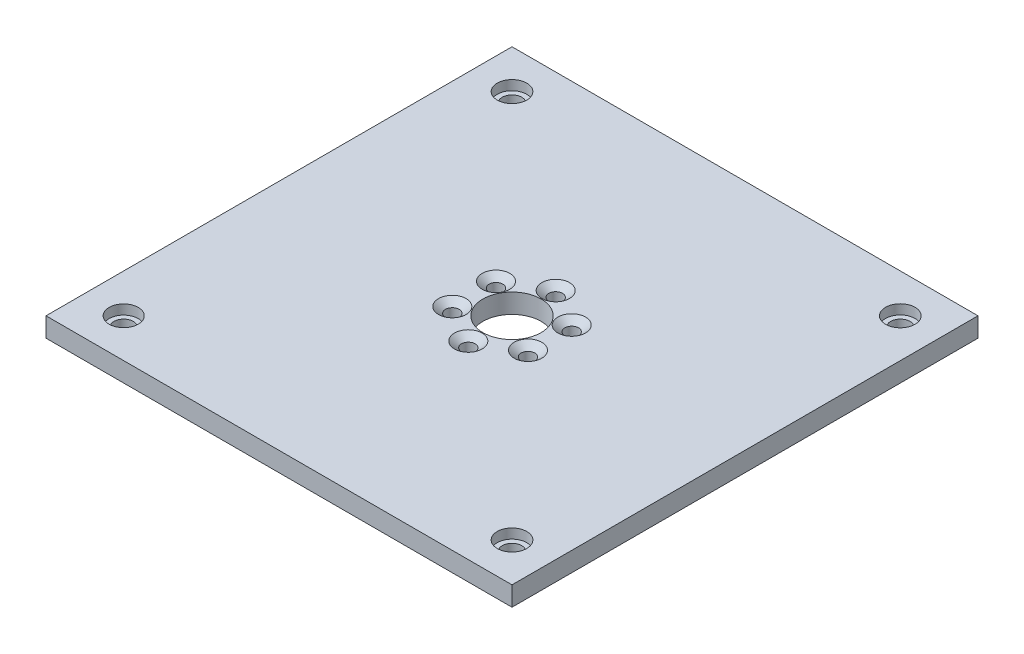
ISO-10303-21;
HEADER;
FILE_DESCRIPTION(('STEP AP214'),'2;1');
FILE_NAME('part.step','',(''),(''),'','','');
FILE_SCHEMA(('AUTOMOTIVE_DESIGN { 1 0 10303 214 1 1 1 1 }'));
ENDSEC;
DATA;
#1=APPLICATION_CONTEXT('core data for automotive mechanical design processes');
#2=APPLICATION_PROTOCOL_DEFINITION('international standard','automotive_design',2000,#1);
#3=PRODUCT_CONTEXT('',#1,'mechanical');
#4=PRODUCT('Part','Part','',(#3));
#5=PRODUCT_RELATED_PRODUCT_CATEGORY('part','',(#4));
#6=PRODUCT_DEFINITION_FORMATION('','',#4);
#7=PRODUCT_DEFINITION_CONTEXT('part definition',#1,'design');
#8=PRODUCT_DEFINITION('design','',#6,#7);
#9=PRODUCT_DEFINITION_SHAPE('','',#8);
#10=(LENGTH_UNIT() NAMED_UNIT(*) SI_UNIT(.MILLI.,.METRE.));
#11=(NAMED_UNIT(*) PLANE_ANGLE_UNIT() SI_UNIT($,.RADIAN.));
#12=(NAMED_UNIT(*) SI_UNIT($,.STERADIAN.) SOLID_ANGLE_UNIT());
#13=UNCERTAINTY_MEASURE_WITH_UNIT(LENGTH_MEASURE(1.E-05),#10,'distance_accuracy_value','');
#14=(GEOMETRIC_REPRESENTATION_CONTEXT(3) GLOBAL_UNCERTAINTY_ASSIGNED_CONTEXT((#13)) GLOBAL_UNIT_ASSIGNED_CONTEXT((#10,
#11,#12)) REPRESENTATION_CONTEXT('',''));
#15=CARTESIAN_POINT('',(0.,0.,0.));
#16=DIRECTION('',(0.,0.,1.));
#17=DIRECTION('',(1.,0.,0.));
#18=AXIS2_PLACEMENT_3D('',#15,#16,#17);
#19=CARTESIAN_POINT('',(139.7,6.35,-12.7));
#20=DIRECTION('',(0.,1.,0.));
#21=DIRECTION('',(0.,0.,1.));
#22=AXIS2_PLACEMENT_3D('',#19,#20,#21);
#23=CYLINDRICAL_SURFACE('',#22,4.826);
#24=CARTESIAN_POINT('',(139.7,3.175,-12.7));
#25=DIRECTION('',(0.,1.,0.));
#26=DIRECTION('',(0.,0.,1.));
#27=AXIS2_PLACEMENT_3D('',#24,#25,#26);
#28=CIRCLE('',#27,4.826);
#29=CARTESIAN_POINT('',(139.7,3.175,-7.874));
#30=VERTEX_POINT('',#29);
#31=EDGE_CURVE('E155',#30,#30,#28,.T.);
#32=ORIENTED_EDGE('',*,*,#31,.F.);
#33=EDGE_LOOP('',(#32));
#34=FACE_BOUND('',#33,.T.);
#35=CARTESIAN_POINT('',(139.7,6.35,-12.7));
#36=DIRECTION('',(0.,1.,0.));
#37=DIRECTION('',(0.,0.,1.));
#38=AXIS2_PLACEMENT_3D('',#35,#36,#37);
#39=CIRCLE('',#38,4.826);
#40=CARTESIAN_POINT('',(139.7,6.35,-7.874));
#41=VERTEX_POINT('',#40);
#42=EDGE_CURVE('E158',#41,#41,#39,.T.);
#43=ORIENTED_EDGE('',*,*,#42,.T.);
#44=EDGE_LOOP('',(#43));
#45=FACE_BOUND('',#44,.T.);
#46=ADVANCED_FACE('F16',(#34,#45),#23,.F.);
#47=CARTESIAN_POINT('',(139.7,6.35,-139.7));
#48=DIRECTION('',(0.,1.,0.));
#49=DIRECTION('',(0.,0.,1.));
#50=AXIS2_PLACEMENT_3D('',#47,#48,#49);
#51=CYLINDRICAL_SURFACE('',#50,4.826);
#52=CARTESIAN_POINT('',(139.7,3.175,-139.7));
#53=DIRECTION('',(0.,1.,0.));
#54=DIRECTION('',(0.,0.,1.));
#55=AXIS2_PLACEMENT_3D('',#52,#53,#54);
#56=CIRCLE('',#55,4.826);
#57=CARTESIAN_POINT('',(139.7,3.175,-134.874));
#58=VERTEX_POINT('',#57);
#59=EDGE_CURVE('E152',#58,#58,#56,.T.);
#60=ORIENTED_EDGE('',*,*,#59,.F.);
#61=EDGE_LOOP('',(#60));
#62=FACE_BOUND('',#61,.T.);
#63=CARTESIAN_POINT('',(139.7,6.35,-139.7));
#64=DIRECTION('',(0.,1.,0.));
#65=DIRECTION('',(0.,0.,1.));
#66=AXIS2_PLACEMENT_3D('',#63,#64,#65);
#67=CIRCLE('',#66,4.826);
#68=CARTESIAN_POINT('',(139.7,6.35,-134.874));
#69=VERTEX_POINT('',#68);
#70=EDGE_CURVE('E161',#69,#69,#67,.T.);
#71=ORIENTED_EDGE('',*,*,#70,.T.);
#72=EDGE_LOOP('',(#71));
#73=FACE_BOUND('',#72,.T.);
#74=ADVANCED_FACE('F288',(#62,#73),#51,.F.);
#75=CARTESIAN_POINT('',(12.7,6.35,-139.7));
#76=DIRECTION('',(0.,1.,0.));
#77=DIRECTION('',(0.,0.,1.));
#78=AXIS2_PLACEMENT_3D('',#75,#76,#77);
#79=CYLINDRICAL_SURFACE('',#78,4.826);
#80=CARTESIAN_POINT('',(12.7,3.175,-139.7));
#81=DIRECTION('',(0.,1.,0.));
#82=DIRECTION('',(0.,0.,1.));
#83=AXIS2_PLACEMENT_3D('',#80,#81,#82);
#84=CIRCLE('',#83,4.826);
#85=CARTESIAN_POINT('',(12.7,3.175,-134.874));
#86=VERTEX_POINT('',#85);
#87=EDGE_CURVE('E149',#86,#86,#84,.T.);
#88=ORIENTED_EDGE('',*,*,#87,.F.);
#89=EDGE_LOOP('',(#88));
#90=FACE_BOUND('',#89,.T.);
#91=CARTESIAN_POINT('',(12.7,6.35,-139.7));
#92=DIRECTION('',(0.,1.,0.));
#93=DIRECTION('',(0.,0.,1.));
#94=AXIS2_PLACEMENT_3D('',#91,#92,#93);
#95=CIRCLE('',#94,4.826);
#96=CARTESIAN_POINT('',(12.7,6.35,-134.874));
#97=VERTEX_POINT('',#96);
#98=EDGE_CURVE('E164',#97,#97,#95,.T.);
#99=ORIENTED_EDGE('',*,*,#98,.T.);
#100=EDGE_LOOP('',(#99));
#101=FACE_BOUND('',#100,.T.);
#102=ADVANCED_FACE('F291',(#90,#101),#79,.F.);
#103=CARTESIAN_POINT('',(12.7,6.35,-12.7));
#104=DIRECTION('',(0.,1.,0.));
#105=DIRECTION('',(0.,0.,1.));
#106=AXIS2_PLACEMENT_3D('',#103,#104,#105);
#107=CYLINDRICAL_SURFACE('',#106,4.7625);
#108=CARTESIAN_POINT('',(12.7,3.175,-12.7));
#109=DIRECTION('',(0.,1.,0.));
#110=DIRECTION('',(0.,0.,1.));
#111=AXIS2_PLACEMENT_3D('',#108,#109,#110);
#112=CIRCLE('',#111,4.7625);
#113=CARTESIAN_POINT('',(12.7,3.175,-7.9375));
#114=VERTEX_POINT('',#113);
#115=EDGE_CURVE('E72',#114,#114,#112,.T.);
#116=ORIENTED_EDGE('',*,*,#115,.F.);
#117=EDGE_LOOP('',(#116));
#118=FACE_BOUND('',#117,.T.);
#119=CARTESIAN_POINT('',(12.7,6.35,-12.7));
#120=DIRECTION('',(0.,1.,0.));
#121=DIRECTION('',(0.,0.,1.));
#122=AXIS2_PLACEMENT_3D('',#119,#120,#121);
#123=CIRCLE('',#122,4.7625);
#124=CARTESIAN_POINT('',(12.7,6.35,-7.9375));
#125=VERTEX_POINT('',#124);
#126=EDGE_CURVE('E167',#125,#125,#123,.T.);
#127=ORIENTED_EDGE('',*,*,#126,.T.);
#128=EDGE_LOOP('',(#127));
#129=FACE_BOUND('',#128,.T.);
#130=ADVANCED_FACE('F348',(#118,#129),#107,.F.);
#131=CARTESIAN_POINT('',(76.2,6.35000000000001,-90.4875));
#132=DIRECTION('',(0.,1.,0.));
#133=DIRECTION('',(0.,0.,1.));
#134=AXIS2_PLACEMENT_3D('',#131,#132,#133);
#135=CONICAL_SURFACE('',#134,4.5191045,0.872664625997164);
#136=CARTESIAN_POINT('',(76.2,6.35000000000001,-90.4875));
#137=DIRECTION('',(0.,1.,0.));
#138=DIRECTION('',(0.,0.,1.));
#139=AXIS2_PLACEMENT_3D('',#136,#137,#138);
#140=CIRCLE('',#139,4.5191045);
#141=CARTESIAN_POINT('',(76.2,6.35000000000001,-85.9683955));
#142=VERTEX_POINT('',#141);
#143=EDGE_CURVE('E19',#142,#142,#140,.T.);
#144=ORIENTED_EDGE('',*,*,#143,.T.);
#145=EDGE_LOOP('',(#144));
#146=FACE_BOUND('',#145,.T.);
#147=CARTESIAN_POINT('',(76.2,4.44423314172182,-90.4875));
#148=DIRECTION('',(0.,1.,0.));
#149=DIRECTION('',(0.,0.,1.));
#150=AXIS2_PLACEMENT_3D('',#147,#148,#149);
#151=CIRCLE('',#150,2.2479);
#152=CARTESIAN_POINT('',(76.2,4.44423314172182,-88.2396));
#153=VERTEX_POINT('',#152);
#154=EDGE_CURVE('E99',#153,#153,#151,.F.);
#155=ORIENTED_EDGE('',*,*,#154,.T.);
#156=EDGE_LOOP('',(#155));
#157=FACE_BOUND('',#156,.T.);
#158=ADVANCED_FACE('F188',(#146,#157),#135,.F.);
#159=CARTESIAN_POINT('',(88.5733379565704,6.35,-83.3437500000003));
#160=DIRECTION('',(0.,1.,0.));
#161=DIRECTION('',(-1.,0.,0.));
#162=AXIS2_PLACEMENT_3D('',#159,#160,#161);
#163=CONICAL_SURFACE('',#162,4.5191045,0.872664625997166);
#164=CARTESIAN_POINT('',(88.5733379565704,6.35,-83.3437500000003));
#165=DIRECTION('',(0.,1.,0.));
#166=DIRECTION('',(-1.,0.,0.));
#167=AXIS2_PLACEMENT_3D('',#164,#165,#166);
#168=CIRCLE('',#167,4.5191045);
#169=CARTESIAN_POINT('',(84.0542334565704,6.35,-83.3437500000003));
#170=VERTEX_POINT('',#169);
#171=EDGE_CURVE('E181',#170,#170,#168,.T.);
#172=ORIENTED_EDGE('',*,*,#171,.T.);
#173=EDGE_LOOP('',(#172));
#174=FACE_BOUND('',#173,.T.);
#175=CARTESIAN_POINT('',(88.5733379565704,4.44423314172182,-83.3437500000003));
#176=DIRECTION('',(0.,1.,0.));
#177=DIRECTION('',(0.,0.,1.));
#178=AXIS2_PLACEMENT_3D('',#175,#176,#177);
#179=CIRCLE('',#178,2.2479);
#180=CARTESIAN_POINT('',(88.5733379565704,4.44423314172182,-81.0958500000003));
#181=VERTEX_POINT('',#180);
#182=EDGE_CURVE('E96',#181,#181,#179,.F.);
#183=ORIENTED_EDGE('',*,*,#182,.T.);
#184=EDGE_LOOP('',(#183));
#185=FACE_BOUND('',#184,.T.);
#186=ADVANCED_FACE('F313',(#174,#185),#163,.F.);
#187=CARTESIAN_POINT('',(88.5733379565707,6.35,-69.0562500000002));
#188=DIRECTION('',(0.,1.,0.));
#189=DIRECTION('',(-1.,0.,0.));
#190=AXIS2_PLACEMENT_3D('',#187,#188,#189);
#191=CONICAL_SURFACE('',#190,4.5191045,0.872664625997166);
#192=CARTESIAN_POINT('',(88.5733379565707,6.35,-69.0562500000002));
#193=DIRECTION('',(0.,1.,0.));
#194=DIRECTION('',(-1.,0.,0.));
#195=AXIS2_PLACEMENT_3D('',#192,#193,#194);
#196=CIRCLE('',#195,4.5191045);
#197=CARTESIAN_POINT('',(84.0542334565707,6.35,-69.0562500000002));
#198=VERTEX_POINT('',#197);
#199=EDGE_CURVE('E179',#198,#198,#196,.T.);
#200=ORIENTED_EDGE('',*,*,#199,.T.);
#201=EDGE_LOOP('',(#200));
#202=FACE_BOUND('',#201,.T.);
#203=CARTESIAN_POINT('',(88.5733379565707,4.44423314172182,-69.0562500000002));
#204=DIRECTION('',(0.,1.,0.));
#205=DIRECTION('',(0.,0.,1.));
#206=AXIS2_PLACEMENT_3D('',#203,#204,#205);
#207=CIRCLE('',#206,2.2479);
#208=CARTESIAN_POINT('',(88.5733379565707,4.44423314172182,-66.8083500000002));
#209=VERTEX_POINT('',#208);
#210=EDGE_CURVE('E93',#209,#209,#207,.F.);
#211=ORIENTED_EDGE('',*,*,#210,.T.);
#212=EDGE_LOOP('',(#211));
#213=FACE_BOUND('',#212,.T.);
#214=ADVANCED_FACE('F309',(#202,#213),#191,.F.);
#215=CARTESIAN_POINT('',(76.2000000000006,6.35000000000001,-61.9125));
#216=DIRECTION('',(0.,1.,0.));
#217=DIRECTION('',(0.,0.,1.));
#218=AXIS2_PLACEMENT_3D('',#215,#216,#217);
#219=CONICAL_SURFACE('',#218,4.5191045,0.872664625997165);
#220=CARTESIAN_POINT('',(76.2000000000006,6.35000000000001,-61.9125));
#221=DIRECTION('',(0.,1.,0.));
#222=DIRECTION('',(0.,0.,1.));
#223=AXIS2_PLACEMENT_3D('',#220,#221,#222);
#224=CIRCLE('',#223,4.5191045);
#225=CARTESIAN_POINT('',(76.2000000000006,6.35000000000001,-57.3933955));
#226=VERTEX_POINT('',#225);
#227=EDGE_CURVE('E176',#226,#226,#224,.T.);
#228=ORIENTED_EDGE('',*,*,#227,.T.);
#229=EDGE_LOOP('',(#228));
#230=FACE_BOUND('',#229,.T.);
#231=CARTESIAN_POINT('',(76.2000000000006,4.44423314172182,-61.9125));
#232=DIRECTION('',(0.,1.,0.));
#233=DIRECTION('',(0.,0.,1.));
#234=AXIS2_PLACEMENT_3D('',#231,#232,#233);
#235=CIRCLE('',#234,2.2479);
#236=CARTESIAN_POINT('',(76.2000000000006,4.44423314172182,-59.6646));
#237=VERTEX_POINT('',#236);
#238=EDGE_CURVE('E90',#237,#237,#235,.F.);
#239=ORIENTED_EDGE('',*,*,#238,.T.);
#240=EDGE_LOOP('',(#239));
#241=FACE_BOUND('',#240,.T.);
#242=ADVANCED_FACE('F312',(#230,#241),#219,.F.);
#243=CARTESIAN_POINT('',(63.8266620434304,6.35000000000001,-69.0562499999998));
#244=DIRECTION('',(0.,1.,0.));
#245=DIRECTION('',(0.,0.,1.));
#246=AXIS2_PLACEMENT_3D('',#243,#244,#245);
#247=CONICAL_SURFACE('',#246,4.5191045,0.872664625997164);
#248=CARTESIAN_POINT('',(63.8266620434304,6.35000000000001,-69.0562499999998));
#249=DIRECTION('',(0.,1.,0.));
#250=DIRECTION('',(0.,0.,1.));
#251=AXIS2_PLACEMENT_3D('',#248,#249,#250);
#252=CIRCLE('',#251,4.5191045);
#253=CARTESIAN_POINT('',(63.8266620434304,6.35000000000001,-64.5371454999998));
#254=VERTEX_POINT('',#253);
#255=EDGE_CURVE('E173',#254,#254,#252,.T.);
#256=ORIENTED_EDGE('',*,*,#255,.T.);
#257=EDGE_LOOP('',(#256));
#258=FACE_BOUND('',#257,.T.);
#259=CARTESIAN_POINT('',(63.8266620434304,4.44423314172182,-69.0562499999998));
#260=DIRECTION('',(0.,1.,0.));
#261=DIRECTION('',(0.,0.,1.));
#262=AXIS2_PLACEMENT_3D('',#259,#260,#261);
#263=CIRCLE('',#262,2.2479);
#264=CARTESIAN_POINT('',(63.8266620434304,4.44423314172182,-66.8083499999998));
#265=VERTEX_POINT('',#264);
#266=EDGE_CURVE('E87',#265,#265,#263,.F.);
#267=ORIENTED_EDGE('',*,*,#266,.T.);
#268=EDGE_LOOP('',(#267));
#269=FACE_BOUND('',#268,.T.);
#270=ADVANCED_FACE('F204',(#258,#269),#247,.F.);
#271=CARTESIAN_POINT('',(63.8266620434301,6.35,-83.3437499999998));
#272=DIRECTION('',(0.,1.,0.));
#273=DIRECTION('',(-1.,0.,0.));
#274=AXIS2_PLACEMENT_3D('',#271,#272,#273);
#275=CONICAL_SURFACE('',#274,4.5191045,0.872664625997166);
#276=CARTESIAN_POINT('',(63.8266620434301,6.35,-83.3437499999998));
#277=DIRECTION('',(0.,1.,0.));
#278=DIRECTION('',(-1.,0.,0.));
#279=AXIS2_PLACEMENT_3D('',#276,#277,#278);
#280=CIRCLE('',#279,4.5191045);
#281=CARTESIAN_POINT('',(59.3075575434301,6.35,-83.3437499999998));
#282=VERTEX_POINT('',#281);
#283=EDGE_CURVE('E170',#282,#282,#280,.T.);
#284=ORIENTED_EDGE('',*,*,#283,.T.);
#285=EDGE_LOOP('',(#284));
#286=FACE_BOUND('',#285,.T.);
#287=CARTESIAN_POINT('',(63.8266620434301,4.44423314172182,-83.3437499999998));
#288=DIRECTION('',(0.,1.,0.));
#289=DIRECTION('',(0.,0.,1.));
#290=AXIS2_PLACEMENT_3D('',#287,#288,#289);
#291=CIRCLE('',#290,2.2479);
#292=CARTESIAN_POINT('',(63.8266620434301,4.44423314172182,-81.0958499999998));
#293=VERTEX_POINT('',#292);
#294=EDGE_CURVE('E83',#293,#293,#291,.F.);
#295=ORIENTED_EDGE('',*,*,#294,.T.);
#296=EDGE_LOOP('',(#295));
#297=FACE_BOUND('',#296,.T.);
#298=ADVANCED_FACE('F193',(#286,#297),#275,.F.);
#299=CARTESIAN_POINT('',(0.,6.35,0.));
#300=DIRECTION('',(0.,-1.,0.));
#301=DIRECTION('',(0.,0.,-1.));
#302=AXIS2_PLACEMENT_3D('',#299,#300,#301);
#303=PLANE('',#302);
#304=ORIENTED_EDGE('',*,*,#42,.F.);
#305=EDGE_LOOP('',(#304));
#306=FACE_BOUND('',#305,.T.);
#307=ORIENTED_EDGE('',*,*,#70,.F.);
#308=EDGE_LOOP('',(#307));
#309=FACE_BOUND('',#308,.T.);
#310=ORIENTED_EDGE('',*,*,#98,.F.);
#311=EDGE_LOOP('',(#310));
#312=FACE_BOUND('',#311,.T.);
#313=ORIENTED_EDGE('',*,*,#126,.F.);
#314=EDGE_LOOP('',(#313));
#315=FACE_BOUND('',#314,.T.);
#316=CARTESIAN_POINT('',(76.2,6.35,-76.2));
#317=DIRECTION('',(0.,-1.,0.));
#318=DIRECTION('',(0.,0.,-1.));
#319=AXIS2_PLACEMENT_3D('',#316,#317,#318);
#320=CIRCLE('',#319,9.525);
#321=CARTESIAN_POINT('',(76.2,6.35,-85.725));
#322=VERTEX_POINT('',#321);
#323=EDGE_CURVE('E86',#322,#322,#320,.T.);
#324=ORIENTED_EDGE('',*,*,#323,.T.);
#325=EDGE_LOOP('',(#324));
#326=FACE_BOUND('',#325,.T.);
#327=ORIENTED_EDGE('',*,*,#283,.F.);
#328=EDGE_LOOP('',(#327));
#329=FACE_BOUND('',#328,.T.);
#330=ORIENTED_EDGE('',*,*,#255,.F.);
#331=EDGE_LOOP('',(#330));
#332=FACE_BOUND('',#331,.T.);
#333=ORIENTED_EDGE('',*,*,#227,.F.);
#334=EDGE_LOOP('',(#333));
#335=FACE_BOUND('',#334,.T.);
#336=ORIENTED_EDGE('',*,*,#199,.F.);
#337=EDGE_LOOP('',(#336));
#338=FACE_BOUND('',#337,.T.);
#339=ORIENTED_EDGE('',*,*,#171,.F.);
#340=EDGE_LOOP('',(#339));
#341=FACE_BOUND('',#340,.T.);
#342=ORIENTED_EDGE('',*,*,#143,.F.);
#343=EDGE_LOOP('',(#342));
#344=FACE_BOUND('',#343,.T.);
#345=DIRECTION('',(0.,0.,1.));
#346=VECTOR('',#345,1.);
#347=CARTESIAN_POINT('',(152.4,6.35,0.));
#348=LINE('',#347,#346);
#349=CARTESIAN_POINT('',(152.4,6.35,0.));
#350=VERTEX_POINT('',#349);
#351=CARTESIAN_POINT('',(152.4,6.35,-152.4));
#352=VERTEX_POINT('',#351);
#353=EDGE_CURVE('E56',#350,#352,#348,.F.);
#354=ORIENTED_EDGE('',*,*,#353,.T.);
#355=DIRECTION('',(1.,0.,0.));
#356=VECTOR('',#355,1.);
#357=CARTESIAN_POINT('',(0.,6.35,-152.4));
#358=LINE('',#357,#356);
#359=CARTESIAN_POINT('',(0.,6.35,-152.4));
#360=VERTEX_POINT('',#359);
#361=EDGE_CURVE('E59',#352,#360,#358,.F.);
#362=ORIENTED_EDGE('',*,*,#361,.T.);
#363=DIRECTION('',(0.,0.,-1.));
#364=VECTOR('',#363,1.);
#365=CARTESIAN_POINT('',(0.,6.35,0.));
#366=LINE('',#365,#364);
#367=CARTESIAN_POINT('',(0.,6.35,0.));
#368=VERTEX_POINT('',#367);
#369=EDGE_CURVE('E333',#360,#368,#366,.F.);
#370=ORIENTED_EDGE('',*,*,#369,.T.);
#371=DIRECTION('',(-1.,0.,0.));
#372=VECTOR('',#371,1.);
#373=CARTESIAN_POINT('',(0.,6.35,0.));
#374=LINE('',#373,#372);
#375=EDGE_CURVE('E54',#368,#350,#374,.F.);
#376=ORIENTED_EDGE('',*,*,#375,.T.);
#377=EDGE_LOOP('',(#354,#362,#370,#376));
#378=FACE_BOUND('',#377,.T.);
#379=ADVANCED_FACE('F58',(#306,#309,#312,#315,#326,#329,#332,#335,#338,#341,#344,#378),#303,.F.);
#380=CARTESIAN_POINT('',(0.,3.175,0.));
#381=DIRECTION('',(0.,1.,0.));
#382=DIRECTION('',(0.,0.,1.));
#383=AXIS2_PLACEMENT_3D('',#380,#381,#382);
#384=PLANE('',#383);
#385=CARTESIAN_POINT('',(139.7,3.175,-12.7));
#386=DIRECTION('',(0.,1.,0.));
#387=DIRECTION('',(0.,0.,1.));
#388=AXIS2_PLACEMENT_3D('',#385,#386,#387);
#389=CIRCLE('',#388,3.175);
#390=CARTESIAN_POINT('',(139.7,3.175,-9.525));
#391=VERTEX_POINT('',#390);
#392=EDGE_CURVE('E142',#391,#391,#389,.F.);
#393=ORIENTED_EDGE('',*,*,#392,.T.);
#394=EDGE_LOOP('',(#393));
#395=FACE_BOUND('',#394,.T.);
#396=ORIENTED_EDGE('',*,*,#31,.T.);
#397=EDGE_LOOP('',(#396));
#398=FACE_BOUND('',#397,.T.);
#399=ADVANCED_FACE('F192',(#395,#398),#384,.T.);
#400=CARTESIAN_POINT('',(0.,3.175,0.));
#401=DIRECTION('',(0.,1.,0.));
#402=DIRECTION('',(0.,0.,1.));
#403=AXIS2_PLACEMENT_3D('',#400,#401,#402);
#404=PLANE('',#403);
#405=CARTESIAN_POINT('',(139.7,3.175,-139.7));
#406=DIRECTION('',(0.,1.,0.));
#407=DIRECTION('',(0.,0.,1.));
#408=AXIS2_PLACEMENT_3D('',#405,#406,#407);
#409=CIRCLE('',#408,3.175);
#410=CARTESIAN_POINT('',(139.7,3.175,-136.525));
#411=VERTEX_POINT('',#410);
#412=EDGE_CURVE('E139',#411,#411,#409,.F.);
#413=ORIENTED_EDGE('',*,*,#412,.T.);
#414=EDGE_LOOP('',(#413));
#415=FACE_BOUND('',#414,.T.);
#416=ORIENTED_EDGE('',*,*,#59,.T.);
#417=EDGE_LOOP('',(#416));
#418=FACE_BOUND('',#417,.T.);
#419=ADVANCED_FACE('F201',(#415,#418),#404,.T.);
#420=CARTESIAN_POINT('',(0.,3.175,0.));
#421=DIRECTION('',(0.,1.,0.));
#422=DIRECTION('',(0.,0.,1.));
#423=AXIS2_PLACEMENT_3D('',#420,#421,#422);
#424=PLANE('',#423);
#425=CARTESIAN_POINT('',(12.7,3.175,-139.7));
#426=DIRECTION('',(0.,1.,0.));
#427=DIRECTION('',(0.,0.,1.));
#428=AXIS2_PLACEMENT_3D('',#425,#426,#427);
#429=CIRCLE('',#428,3.175);
#430=CARTESIAN_POINT('',(12.7,3.175,-136.525));
#431=VERTEX_POINT('',#430);
#432=EDGE_CURVE('E136',#431,#431,#429,.F.);
#433=ORIENTED_EDGE('',*,*,#432,.T.);
#434=EDGE_LOOP('',(#433));
#435=FACE_BOUND('',#434,.T.);
#436=ORIENTED_EDGE('',*,*,#87,.T.);
#437=EDGE_LOOP('',(#436));
#438=FACE_BOUND('',#437,.T.);
#439=ADVANCED_FACE('F275',(#435,#438),#424,.T.);
#440=CARTESIAN_POINT('',(0.,3.175,0.));
#441=DIRECTION('',(0.,1.,0.));
#442=DIRECTION('',(0.,0.,1.));
#443=AXIS2_PLACEMENT_3D('',#440,#441,#442);
#444=PLANE('',#443);
#445=CARTESIAN_POINT('',(12.7,3.175,-12.7));
#446=DIRECTION('',(0.,1.,0.));
#447=DIRECTION('',(0.,0.,1.));
#448=AXIS2_PLACEMENT_3D('',#445,#446,#447);
#449=CIRCLE('',#448,3.175);
#450=CARTESIAN_POINT('',(12.7,3.175,-9.525));
#451=VERTEX_POINT('',#450);
#452=EDGE_CURVE('E132',#451,#451,#449,.F.);
#453=ORIENTED_EDGE('',*,*,#452,.T.);
#454=EDGE_LOOP('',(#453));
#455=FACE_BOUND('',#454,.T.);
#456=ORIENTED_EDGE('',*,*,#115,.T.);
#457=EDGE_LOOP('',(#456));
#458=FACE_BOUND('',#457,.T.);
#459=ADVANCED_FACE('F272',(#455,#458),#444,.T.);
#460=CARTESIAN_POINT('',(0.,6.35,-152.4));
#461=DIRECTION('',(0.,0.,1.));
#462=DIRECTION('',(1.,0.,0.));
#463=AXIS2_PLACEMENT_3D('',#460,#461,#462);
#464=PLANE('',#463);
#465=ORIENTED_EDGE('',*,*,#361,.F.);
#466=DIRECTION('',(0.,1.,0.));
#467=VECTOR('',#466,1.);
#468=CARTESIAN_POINT('',(152.4,6.35,-152.4));
#469=LINE('',#468,#467);
#470=CARTESIAN_POINT('',(152.4,0.,-152.4));
#471=VERTEX_POINT('',#470);
#472=EDGE_CURVE('E64',#352,#471,#469,.F.);
#473=ORIENTED_EDGE('',*,*,#472,.T.);
#474=DIRECTION('',(1.,0.,0.));
#475=VECTOR('',#474,1.);
#476=CARTESIAN_POINT('',(0.,0.,-152.4));
#477=LINE('',#476,#475);
#478=CARTESIAN_POINT('',(0.,0.,-152.4));
#479=VERTEX_POINT('',#478);
#480=EDGE_CURVE('E135',#479,#471,#477,.T.);
#481=ORIENTED_EDGE('',*,*,#480,.F.);
#482=DIRECTION('',(0.,1.,0.));
#483=VECTOR('',#482,1.);
#484=CARTESIAN_POINT('',(0.,6.35,-152.4));
#485=LINE('',#484,#483);
#486=EDGE_CURVE('E70',#479,#360,#485,.T.);
#487=ORIENTED_EDGE('',*,*,#486,.T.);
#488=EDGE_LOOP('',(#465,#473,#481,#487));
#489=FACE_BOUND('',#488,.T.);
#490=ADVANCED_FACE('F67',(#489),#464,.F.);
#491=CARTESIAN_POINT('',(152.4,6.35,0.));
#492=DIRECTION('',(-1.,0.,0.));
#493=DIRECTION('',(0.,0.,1.));
#494=AXIS2_PLACEMENT_3D('',#491,#492,#493);
#495=PLANE('',#494);
#496=ORIENTED_EDGE('',*,*,#353,.F.);
#497=DIRECTION('',(0.,1.,0.));
#498=VECTOR('',#497,1.);
#499=CARTESIAN_POINT('',(152.4,6.35,0.));
#500=LINE('',#499,#498);
#501=CARTESIAN_POINT('',(152.4,0.,0.));
#502=VERTEX_POINT('',#501);
#503=EDGE_CURVE('E79',#350,#502,#500,.F.);
#504=ORIENTED_EDGE('',*,*,#503,.T.);
#505=DIRECTION('',(0.,0.,-1.));
#506=VECTOR('',#505,1.);
#507=CARTESIAN_POINT('',(152.4,0.,0.));
#508=LINE('',#507,#506);
#509=EDGE_CURVE('E76',#471,#502,#508,.F.);
#510=ORIENTED_EDGE('',*,*,#509,.F.);
#511=ORIENTED_EDGE('',*,*,#472,.F.);
#512=EDGE_LOOP('',(#496,#504,#510,#511));
#513=FACE_BOUND('',#512,.T.);
#514=ADVANCED_FACE('F74',(#513),#495,.F.);
#515=CARTESIAN_POINT('',(0.,6.35,0.));
#516=DIRECTION('',(0.,0.,-1.));
#517=DIRECTION('',(-1.,0.,0.));
#518=AXIS2_PLACEMENT_3D('',#515,#516,#517);
#519=PLANE('',#518);
#520=ORIENTED_EDGE('',*,*,#375,.F.);
#521=DIRECTION('',(0.,1.,0.));
#522=VECTOR('',#521,1.);
#523=CARTESIAN_POINT('',(0.,6.35,0.));
#524=LINE('',#523,#522);
#525=CARTESIAN_POINT('',(0.,0.,0.));
#526=VERTEX_POINT('',#525);
#527=EDGE_CURVE('E34',#368,#526,#524,.F.);
#528=ORIENTED_EDGE('',*,*,#527,.T.);
#529=DIRECTION('',(1.,0.,0.));
#530=VECTOR('',#529,1.);
#531=CARTESIAN_POINT('',(0.,0.,0.));
#532=LINE('',#531,#530);
#533=EDGE_CURVE('E326',#502,#526,#532,.F.);
#534=ORIENTED_EDGE('',*,*,#533,.F.);
#535=ORIENTED_EDGE('',*,*,#503,.F.);
#536=EDGE_LOOP('',(#520,#528,#534,#535));
#537=FACE_BOUND('',#536,.T.);
#538=ADVANCED_FACE('F264',(#537),#519,.F.);
#539=CARTESIAN_POINT('',(0.,6.35,0.));
#540=DIRECTION('',(1.,0.,0.));
#541=DIRECTION('',(0.,0.,-1.));
#542=AXIS2_PLACEMENT_3D('',#539,#540,#541);
#543=PLANE('',#542);
#544=ORIENTED_EDGE('',*,*,#369,.F.);
#545=ORIENTED_EDGE('',*,*,#486,.F.);
#546=DIRECTION('',(0.,0.,-1.));
#547=VECTOR('',#546,1.);
#548=CARTESIAN_POINT('',(0.,0.,0.));
#549=LINE('',#548,#547);
#550=EDGE_CURVE('E131',#526,#479,#549,.T.);
#551=ORIENTED_EDGE('',*,*,#550,.F.);
#552=ORIENTED_EDGE('',*,*,#527,.F.);
#553=EDGE_LOOP('',(#544,#545,#551,#552));
#554=FACE_BOUND('',#553,.T.);
#555=ADVANCED_FACE('F260',(#554),#543,.F.);
#556=CARTESIAN_POINT('',(76.2,6.35,-90.4875));
#557=DIRECTION('',(0.,1.,0.));
#558=DIRECTION('',(0.,0.,1.));
#559=AXIS2_PLACEMENT_3D('',#556,#557,#558);
#560=CYLINDRICAL_SURFACE('',#559,2.2479);
#561=ORIENTED_EDGE('',*,*,#154,.F.);
#562=EDGE_LOOP('',(#561));
#563=FACE_BOUND('',#562,.T.);
#564=CARTESIAN_POINT('',(76.2,0.,-90.4875));
#565=DIRECTION('',(0.,1.,0.));
#566=DIRECTION('',(0.,0.,1.));
#567=AXIS2_PLACEMENT_3D('',#564,#565,#566);
#568=CIRCLE('',#567,2.2479);
#569=CARTESIAN_POINT('',(76.2,0.,-88.2396));
#570=VERTEX_POINT('',#569);
#571=EDGE_CURVE('E128',#570,#570,#568,.T.);
#572=ORIENTED_EDGE('',*,*,#571,.F.);
#573=EDGE_LOOP('',(#572));
#574=FACE_BOUND('',#573,.T.);
#575=ADVANCED_FACE('F256',(#563,#574),#560,.F.);
#576=CARTESIAN_POINT('',(88.5733379565704,6.35,-83.3437500000003));
#577=DIRECTION('',(0.,1.,0.));
#578=DIRECTION('',(0.,0.,1.));
#579=AXIS2_PLACEMENT_3D('',#576,#577,#578);
#580=CYLINDRICAL_SURFACE('',#579,2.2479);
#581=ORIENTED_EDGE('',*,*,#182,.F.);
#582=EDGE_LOOP('',(#581));
#583=FACE_BOUND('',#582,.T.);
#584=CARTESIAN_POINT('',(88.5733379565704,0.,-83.3437500000003));
#585=DIRECTION('',(0.,1.,0.));
#586=DIRECTION('',(0.,0.,1.));
#587=AXIS2_PLACEMENT_3D('',#584,#585,#586);
#588=CIRCLE('',#587,2.2479);
#589=CARTESIAN_POINT('',(88.5733379565704,0.,-81.0958500000003));
#590=VERTEX_POINT('',#589);
#591=EDGE_CURVE('E125',#590,#590,#588,.T.);
#592=ORIENTED_EDGE('',*,*,#591,.F.);
#593=EDGE_LOOP('',(#592));
#594=FACE_BOUND('',#593,.T.);
#595=ADVANCED_FACE('F252',(#583,#594),#580,.F.);
#596=CARTESIAN_POINT('',(88.5733379565707,6.35,-69.0562500000002));
#597=DIRECTION('',(0.,1.,0.));
#598=DIRECTION('',(0.,0.,1.));
#599=AXIS2_PLACEMENT_3D('',#596,#597,#598);
#600=CYLINDRICAL_SURFACE('',#599,2.2479);
#601=ORIENTED_EDGE('',*,*,#210,.F.);
#602=EDGE_LOOP('',(#601));
#603=FACE_BOUND('',#602,.T.);
#604=CARTESIAN_POINT('',(88.5733379565707,0.,-69.0562500000002));
#605=DIRECTION('',(0.,1.,0.));
#606=DIRECTION('',(0.,0.,1.));
#607=AXIS2_PLACEMENT_3D('',#604,#605,#606);
#608=CIRCLE('',#607,2.2479);
#609=CARTESIAN_POINT('',(88.5733379565707,0.,-66.8083500000002));
#610=VERTEX_POINT('',#609);
#611=EDGE_CURVE('E122',#610,#610,#608,.T.);
#612=ORIENTED_EDGE('',*,*,#611,.F.);
#613=EDGE_LOOP('',(#612));
#614=FACE_BOUND('',#613,.T.);
#615=ADVANCED_FACE('F248',(#603,#614),#600,.F.);
#616=CARTESIAN_POINT('',(76.2000000000006,6.35,-61.9125));
#617=DIRECTION('',(0.,1.,0.));
#618=DIRECTION('',(0.,0.,1.));
#619=AXIS2_PLACEMENT_3D('',#616,#617,#618);
#620=CYLINDRICAL_SURFACE('',#619,2.2479);
#621=ORIENTED_EDGE('',*,*,#238,.F.);
#622=EDGE_LOOP('',(#621));
#623=FACE_BOUND('',#622,.T.);
#624=CARTESIAN_POINT('',(76.2000000000006,0.,-61.9125));
#625=DIRECTION('',(0.,1.,0.));
#626=DIRECTION('',(0.,0.,1.));
#627=AXIS2_PLACEMENT_3D('',#624,#625,#626);
#628=CIRCLE('',#627,2.2479);
#629=CARTESIAN_POINT('',(76.2000000000006,0.,-59.6646));
#630=VERTEX_POINT('',#629);
#631=EDGE_CURVE('E119',#630,#630,#628,.T.);
#632=ORIENTED_EDGE('',*,*,#631,.F.);
#633=EDGE_LOOP('',(#632));
#634=FACE_BOUND('',#633,.T.);
#635=ADVANCED_FACE('F244',(#623,#634),#620,.F.);
#636=CARTESIAN_POINT('',(63.8266620434304,6.35,-69.0562499999998));
#637=DIRECTION('',(0.,1.,0.));
#638=DIRECTION('',(0.,0.,1.));
#639=AXIS2_PLACEMENT_3D('',#636,#637,#638);
#640=CYLINDRICAL_SURFACE('',#639,2.2479);
#641=ORIENTED_EDGE('',*,*,#266,.F.);
#642=EDGE_LOOP('',(#641));
#643=FACE_BOUND('',#642,.T.);
#644=CARTESIAN_POINT('',(63.8266620434304,0.,-69.0562499999998));
#645=DIRECTION('',(0.,1.,0.));
#646=DIRECTION('',(0.,0.,1.));
#647=AXIS2_PLACEMENT_3D('',#644,#645,#646);
#648=CIRCLE('',#647,2.2479);
#649=CARTESIAN_POINT('',(63.8266620434304,0.,-66.8083499999998));
#650=VERTEX_POINT('',#649);
#651=EDGE_CURVE('E116',#650,#650,#648,.T.);
#652=ORIENTED_EDGE('',*,*,#651,.F.);
#653=EDGE_LOOP('',(#652));
#654=FACE_BOUND('',#653,.T.);
#655=ADVANCED_FACE('F240',(#643,#654),#640,.F.);
#656=CARTESIAN_POINT('',(63.8266620434301,6.35,-83.3437499999998));
#657=DIRECTION('',(0.,1.,0.));
#658=DIRECTION('',(0.,0.,1.));
#659=AXIS2_PLACEMENT_3D('',#656,#657,#658);
#660=CYLINDRICAL_SURFACE('',#659,2.2479);
#661=ORIENTED_EDGE('',*,*,#294,.F.);
#662=EDGE_LOOP('',(#661));
#663=FACE_BOUND('',#662,.T.);
#664=CARTESIAN_POINT('',(63.8266620434301,0.,-83.3437499999998));
#665=DIRECTION('',(0.,1.,0.));
#666=DIRECTION('',(0.,0.,1.));
#667=AXIS2_PLACEMENT_3D('',#664,#665,#666);
#668=CIRCLE('',#667,2.2479);
#669=CARTESIAN_POINT('',(63.8266620434301,0.,-81.0958499999998));
#670=VERTEX_POINT('',#669);
#671=EDGE_CURVE('E113',#670,#670,#668,.T.);
#672=ORIENTED_EDGE('',*,*,#671,.F.);
#673=EDGE_LOOP('',(#672));
#674=FACE_BOUND('',#673,.T.);
#675=ADVANCED_FACE('F236',(#663,#674),#660,.F.);
#676=CARTESIAN_POINT('',(76.2,6.35,-76.2));
#677=DIRECTION('',(0.,-1.,0.));
#678=DIRECTION('',(0.,0.,-1.));
#679=AXIS2_PLACEMENT_3D('',#676,#677,#678);
#680=CYLINDRICAL_SURFACE('',#679,9.525);
#681=CARTESIAN_POINT('',(76.2,0.,-76.2));
#682=DIRECTION('',(0.,-1.,0.));
#683=DIRECTION('',(0.,0.,-1.));
#684=AXIS2_PLACEMENT_3D('',#681,#682,#683);
#685=CIRCLE('',#684,9.525);
#686=CARTESIAN_POINT('',(76.2,0.,-85.725));
#687=VERTEX_POINT('',#686);
#688=EDGE_CURVE('E110',#687,#687,#685,.F.);
#689=ORIENTED_EDGE('',*,*,#688,.F.);
#690=EDGE_LOOP('',(#689));
#691=FACE_BOUND('',#690,.T.);
#692=ORIENTED_EDGE('',*,*,#323,.F.);
#693=EDGE_LOOP('',(#692));
#694=FACE_BOUND('',#693,.T.);
#695=ADVANCED_FACE('F232',(#691,#694),#680,.F.);
#696=CARTESIAN_POINT('',(139.7,6.35,-12.7));
#697=DIRECTION('',(0.,1.,0.));
#698=DIRECTION('',(0.,0.,1.));
#699=AXIS2_PLACEMENT_3D('',#696,#697,#698);
#700=CYLINDRICAL_SURFACE('',#699,3.175);
#701=CARTESIAN_POINT('',(139.7,0.,-12.7));
#702=DIRECTION('',(0.,1.,0.));
#703=DIRECTION('',(0.,0.,1.));
#704=AXIS2_PLACEMENT_3D('',#701,#702,#703);
#705=CIRCLE('',#704,3.175);
#706=CARTESIAN_POINT('',(139.7,0.,-9.525));
#707=VERTEX_POINT('',#706);
#708=EDGE_CURVE('E107',#707,#707,#705,.T.);
#709=ORIENTED_EDGE('',*,*,#708,.F.);
#710=EDGE_LOOP('',(#709));
#711=FACE_BOUND('',#710,.T.);
#712=ORIENTED_EDGE('',*,*,#392,.F.);
#713=EDGE_LOOP('',(#712));
#714=FACE_BOUND('',#713,.T.);
#715=ADVANCED_FACE('F228',(#711,#714),#700,.F.);
#716=CARTESIAN_POINT('',(139.7,6.35,-139.7));
#717=DIRECTION('',(0.,1.,0.));
#718=DIRECTION('',(0.,0.,1.));
#719=AXIS2_PLACEMENT_3D('',#716,#717,#718);
#720=CYLINDRICAL_SURFACE('',#719,3.175);
#721=CARTESIAN_POINT('',(139.7,0.,-139.7));
#722=DIRECTION('',(0.,1.,0.));
#723=DIRECTION('',(0.,0.,1.));
#724=AXIS2_PLACEMENT_3D('',#721,#722,#723);
#725=CIRCLE('',#724,3.175);
#726=CARTESIAN_POINT('',(139.7,0.,-136.525));
#727=VERTEX_POINT('',#726);
#728=EDGE_CURVE('E104',#727,#727,#725,.T.);
#729=ORIENTED_EDGE('',*,*,#728,.F.);
#730=EDGE_LOOP('',(#729));
#731=FACE_BOUND('',#730,.T.);
#732=ORIENTED_EDGE('',*,*,#412,.F.);
#733=EDGE_LOOP('',(#732));
#734=FACE_BOUND('',#733,.T.);
#735=ADVANCED_FACE('F224',(#731,#734),#720,.F.);
#736=CARTESIAN_POINT('',(12.7,6.35,-139.7));
#737=DIRECTION('',(0.,1.,0.));
#738=DIRECTION('',(0.,0.,1.));
#739=AXIS2_PLACEMENT_3D('',#736,#737,#738);
#740=CYLINDRICAL_SURFACE('',#739,3.175);
#741=CARTESIAN_POINT('',(12.7,0.,-139.7));
#742=DIRECTION('',(0.,1.,0.));
#743=DIRECTION('',(0.,0.,1.));
#744=AXIS2_PLACEMENT_3D('',#741,#742,#743);
#745=CIRCLE('',#744,3.175);
#746=CARTESIAN_POINT('',(12.7,0.,-136.525));
#747=VERTEX_POINT('',#746);
#748=EDGE_CURVE('E25',#747,#747,#745,.T.);
#749=ORIENTED_EDGE('',*,*,#748,.F.);
#750=EDGE_LOOP('',(#749));
#751=FACE_BOUND('',#750,.T.);
#752=ORIENTED_EDGE('',*,*,#432,.F.);
#753=EDGE_LOOP('',(#752));
#754=FACE_BOUND('',#753,.T.);
#755=ADVANCED_FACE('F217',(#751,#754),#740,.F.);
#756=CARTESIAN_POINT('',(12.7,6.35,-12.7));
#757=DIRECTION('',(0.,1.,0.));
#758=DIRECTION('',(0.,0.,1.));
#759=AXIS2_PLACEMENT_3D('',#756,#757,#758);
#760=CYLINDRICAL_SURFACE('',#759,3.175);
#761=CARTESIAN_POINT('',(12.7,0.,-12.7));
#762=DIRECTION('',(0.,1.,0.));
#763=DIRECTION('',(0.,0.,1.));
#764=AXIS2_PLACEMENT_3D('',#761,#762,#763);
#765=CIRCLE('',#764,3.175);
#766=CARTESIAN_POINT('',(12.7,0.,-9.525));
#767=VERTEX_POINT('',#766);
#768=EDGE_CURVE('E11',#767,#767,#765,.T.);
#769=ORIENTED_EDGE('',*,*,#768,.F.);
#770=EDGE_LOOP('',(#769));
#771=FACE_BOUND('',#770,.T.);
#772=ORIENTED_EDGE('',*,*,#452,.F.);
#773=EDGE_LOOP('',(#772));
#774=FACE_BOUND('',#773,.T.);
#775=ADVANCED_FACE('F211',(#771,#774),#760,.F.);
#776=CARTESIAN_POINT('',(0.,0.,0.));
#777=DIRECTION('',(0.,-1.,0.));
#778=DIRECTION('',(0.,0.,-1.));
#779=AXIS2_PLACEMENT_3D('',#776,#777,#778);
#780=PLANE('',#779);
#781=ORIENTED_EDGE('',*,*,#768,.T.);
#782=EDGE_LOOP('',(#781));
#783=FACE_BOUND('',#782,.T.);
#784=ORIENTED_EDGE('',*,*,#748,.T.);
#785=EDGE_LOOP('',(#784));
#786=FACE_BOUND('',#785,.T.);
#787=ORIENTED_EDGE('',*,*,#728,.T.);
#788=EDGE_LOOP('',(#787));
#789=FACE_BOUND('',#788,.T.);
#790=ORIENTED_EDGE('',*,*,#708,.T.);
#791=EDGE_LOOP('',(#790));
#792=FACE_BOUND('',#791,.T.);
#793=ORIENTED_EDGE('',*,*,#688,.T.);
#794=EDGE_LOOP('',(#793));
#795=FACE_BOUND('',#794,.T.);
#796=ORIENTED_EDGE('',*,*,#671,.T.);
#797=EDGE_LOOP('',(#796));
#798=FACE_BOUND('',#797,.T.);
#799=ORIENTED_EDGE('',*,*,#651,.T.);
#800=EDGE_LOOP('',(#799));
#801=FACE_BOUND('',#800,.T.);
#802=ORIENTED_EDGE('',*,*,#631,.T.);
#803=EDGE_LOOP('',(#802));
#804=FACE_BOUND('',#803,.T.);
#805=ORIENTED_EDGE('',*,*,#611,.T.);
#806=EDGE_LOOP('',(#805));
#807=FACE_BOUND('',#806,.T.);
#808=ORIENTED_EDGE('',*,*,#591,.T.);
#809=EDGE_LOOP('',(#808));
#810=FACE_BOUND('',#809,.T.);
#811=ORIENTED_EDGE('',*,*,#571,.T.);
#812=EDGE_LOOP('',(#811));
#813=FACE_BOUND('',#812,.T.);
#814=ORIENTED_EDGE('',*,*,#533,.T.);
#815=ORIENTED_EDGE('',*,*,#550,.T.);
#816=ORIENTED_EDGE('',*,*,#480,.T.);
#817=ORIENTED_EDGE('',*,*,#509,.T.);
#818=EDGE_LOOP('',(#814,#815,#816,#817));
#819=FACE_BOUND('',#818,.T.);
#820=ADVANCED_FACE('F209',(#783,#786,#789,#792,#795,#798,#801,#804,#807,#810,#813,#819),#780,.T.);
#821=CLOSED_SHELL('',(#46,#74,#102,#130,#158,#186,#214,#242,#270,#298,#379,#399,#419,#439,#459,
#490,#514,#538,#555,#575,#595,#615,#635,#655,#675,#695,#715,#735,#755,#775,#820));
#822=MANIFOLD_SOLID_BREP('B1',#821);
#823=ADVANCED_BREP_SHAPE_REPRESENTATION('',(#18,#822),#14);
#824=SHAPE_DEFINITION_REPRESENTATION(#9,#823);
ENDSEC;
END-ISO-10303-21;
